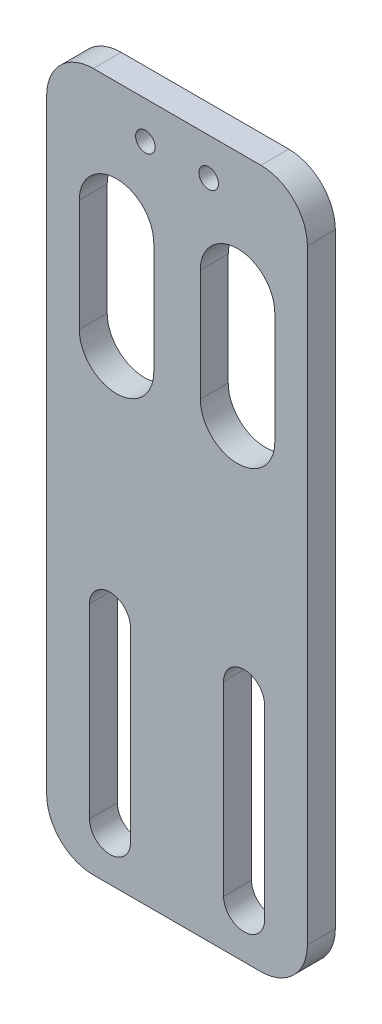
ISO-10303-21;
HEADER;
FILE_DESCRIPTION(('STEP AP214'),'2;1');
FILE_NAME('part.step','',(''),(''),'','','');
FILE_SCHEMA(('AUTOMOTIVE_DESIGN { 1 0 10303 214 1 1 1 1 }'));
ENDSEC;
DATA;
#1=APPLICATION_CONTEXT('core data for automotive mechanical design processes');
#2=APPLICATION_PROTOCOL_DEFINITION('international standard','automotive_design',2000,#1);
#3=PRODUCT_CONTEXT('',#1,'mechanical');
#4=PRODUCT('Part','Part','',(#3));
#5=PRODUCT_RELATED_PRODUCT_CATEGORY('part','',(#4));
#6=PRODUCT_DEFINITION_FORMATION('','',#4);
#7=PRODUCT_DEFINITION_CONTEXT('part definition',#1,'design');
#8=PRODUCT_DEFINITION('design','',#6,#7);
#9=PRODUCT_DEFINITION_SHAPE('','',#8);
#10=(LENGTH_UNIT() NAMED_UNIT(*) SI_UNIT(.MILLI.,.METRE.));
#11=(NAMED_UNIT(*) PLANE_ANGLE_UNIT() SI_UNIT($,.RADIAN.));
#12=(NAMED_UNIT(*) SI_UNIT($,.STERADIAN.) SOLID_ANGLE_UNIT());
#13=UNCERTAINTY_MEASURE_WITH_UNIT(LENGTH_MEASURE(1.E-05),#10,'distance_accuracy_value','');
#14=(GEOMETRIC_REPRESENTATION_CONTEXT(3) GLOBAL_UNCERTAINTY_ASSIGNED_CONTEXT((#13)) GLOBAL_UNIT_ASSIGNED_CONTEXT((#10,
#11,#12)) REPRESENTATION_CONTEXT('',''));
#15=CARTESIAN_POINT('',(0.,0.,0.));
#16=DIRECTION('',(0.,0.,1.));
#17=DIRECTION('',(1.,0.,0.));
#18=AXIS2_PLACEMENT_3D('',#15,#16,#17);
#19=CARTESIAN_POINT('',(-14.,37.5,3.));
#20=DIRECTION('',(1.,0.,0.));
#21=DIRECTION('',(0.,1.,0.));
#22=AXIS2_PLACEMENT_3D('',#19,#20,#21);
#23=PLANE('',#22);
#24=DIRECTION('',(0.,-1.,0.));
#25=VECTOR('',#24,1.);
#26=CARTESIAN_POINT('',(-14.,37.5,3.));
#27=LINE('',#26,#25);
#28=CARTESIAN_POINT('',(-14.,32.5,3.));
#29=VERTEX_POINT('',#28);
#30=CARTESIAN_POINT('',(-14.,-32.5,3.));
#31=VERTEX_POINT('',#30);
#32=EDGE_CURVE('E346',#29,#31,#27,.T.);
#33=ORIENTED_EDGE('',*,*,#32,.F.);
#34=DIRECTION('',(0.,0.,-1.));
#35=VECTOR('',#34,1.);
#36=CARTESIAN_POINT('',(-14.,32.5,3.));
#37=LINE('',#36,#35);
#38=CARTESIAN_POINT('',(-14.,32.5,0.));
#39=VERTEX_POINT('',#38);
#40=EDGE_CURVE('E368',#29,#39,#37,.T.);
#41=ORIENTED_EDGE('',*,*,#40,.T.);
#42=DIRECTION('',(0.,-1.,0.));
#43=VECTOR('',#42,1.);
#44=CARTESIAN_POINT('',(-14.,37.5,0.));
#45=LINE('',#44,#43);
#46=CARTESIAN_POINT('',(-14.,-32.5,0.));
#47=VERTEX_POINT('',#46);
#48=EDGE_CURVE('E339',#39,#47,#45,.T.);
#49=ORIENTED_EDGE('',*,*,#48,.T.);
#50=DIRECTION('',(0.,0.,-1.));
#51=VECTOR('',#50,1.);
#52=CARTESIAN_POINT('',(-14.,-32.5,3.));
#53=LINE('',#52,#51);
#54=EDGE_CURVE('E357',#47,#31,#53,.F.);
#55=ORIENTED_EDGE('',*,*,#54,.T.);
#56=EDGE_LOOP('',(#33,#41,#49,#55));
#57=FACE_BOUND('',#56,.T.);
#58=ADVANCED_FACE('F32',(#57),#23,.F.);
#59=CARTESIAN_POINT('',(14.,-37.5,3.));
#60=DIRECTION('',(0.,1.,0.));
#61=DIRECTION('',(0.,0.,1.));
#62=AXIS2_PLACEMENT_3D('',#59,#60,#61);
#63=PLANE('',#62);
#64=DIRECTION('',(1.,0.,0.));
#65=VECTOR('',#64,1.);
#66=CARTESIAN_POINT('',(14.,-37.5,0.));
#67=LINE('',#66,#65);
#68=CARTESIAN_POINT('',(-8.99999999999999,-37.5,0.));
#69=VERTEX_POINT('',#68);
#70=CARTESIAN_POINT('',(9.00000000000001,-37.5,0.));
#71=VERTEX_POINT('',#70);
#72=EDGE_CURVE('E360',#69,#71,#67,.T.);
#73=ORIENTED_EDGE('',*,*,#72,.T.);
#74=DIRECTION('',(0.,0.,-1.));
#75=VECTOR('',#74,1.);
#76=CARTESIAN_POINT('',(9.00000000000001,-37.5,3.));
#77=LINE('',#76,#75);
#78=CARTESIAN_POINT('',(9.00000000000001,-37.5,3.));
#79=VERTEX_POINT('',#78);
#80=EDGE_CURVE('E11',#71,#79,#77,.F.);
#81=ORIENTED_EDGE('',*,*,#80,.T.);
#82=DIRECTION('',(1.,0.,0.));
#83=VECTOR('',#82,1.);
#84=CARTESIAN_POINT('',(14.,-37.5,3.));
#85=LINE('',#84,#83);
#86=CARTESIAN_POINT('',(-8.99999999999999,-37.5,3.));
#87=VERTEX_POINT('',#86);
#88=EDGE_CURVE('E349',#87,#79,#85,.T.);
#89=ORIENTED_EDGE('',*,*,#88,.F.);
#90=DIRECTION('',(0.,0.,-1.));
#91=VECTOR('',#90,1.);
#92=CARTESIAN_POINT('',(-8.99999999999999,-37.5,3.));
#93=LINE('',#92,#91);
#94=EDGE_CURVE('E40',#87,#69,#93,.T.);
#95=ORIENTED_EDGE('',*,*,#94,.T.);
#96=EDGE_LOOP('',(#73,#81,#89,#95));
#97=FACE_BOUND('',#96,.T.);
#98=ADVANCED_FACE('F399',(#97),#63,.F.);
#99=CARTESIAN_POINT('',(14.,37.5,3.));
#100=DIRECTION('',(-1.,0.,0.));
#101=DIRECTION('',(0.,-1.,0.));
#102=AXIS2_PLACEMENT_3D('',#99,#100,#101);
#103=PLANE('',#102);
#104=DIRECTION('',(0.,1.,0.));
#105=VECTOR('',#104,1.);
#106=CARTESIAN_POINT('',(14.,37.5,0.));
#107=LINE('',#106,#105);
#108=CARTESIAN_POINT('',(14.,-32.5,0.));
#109=VERTEX_POINT('',#108);
#110=CARTESIAN_POINT('',(14.,32.5,0.));
#111=VERTEX_POINT('',#110);
#112=EDGE_CURVE('E363',#109,#111,#107,.T.);
#113=ORIENTED_EDGE('',*,*,#112,.T.);
#114=DIRECTION('',(0.,0.,-1.));
#115=VECTOR('',#114,1.);
#116=CARTESIAN_POINT('',(14.,32.5,3.));
#117=LINE('',#116,#115);
#118=CARTESIAN_POINT('',(14.,32.5,3.));
#119=VERTEX_POINT('',#118);
#120=EDGE_CURVE('E47',#111,#119,#117,.F.);
#121=ORIENTED_EDGE('',*,*,#120,.T.);
#122=DIRECTION('',(0.,1.,0.));
#123=VECTOR('',#122,1.);
#124=CARTESIAN_POINT('',(14.,37.5,3.));
#125=LINE('',#124,#123);
#126=CARTESIAN_POINT('',(14.,-32.5,3.));
#127=VERTEX_POINT('',#126);
#128=EDGE_CURVE('E352',#127,#119,#125,.T.);
#129=ORIENTED_EDGE('',*,*,#128,.F.);
#130=DIRECTION('',(0.,0.,-1.));
#131=VECTOR('',#130,1.);
#132=CARTESIAN_POINT('',(14.,-32.5,3.));
#133=LINE('',#132,#131);
#134=EDGE_CURVE('E391',#127,#109,#133,.T.);
#135=ORIENTED_EDGE('',*,*,#134,.T.);
#136=EDGE_LOOP('',(#113,#121,#129,#135));
#137=FACE_BOUND('',#136,.T.);
#138=ADVANCED_FACE('F409',(#137),#103,.F.);
#139=CARTESIAN_POINT('',(14.,37.5,3.));
#140=DIRECTION('',(0.,-1.,0.));
#141=DIRECTION('',(0.,0.,-1.));
#142=AXIS2_PLACEMENT_3D('',#139,#140,#141);
#143=PLANE('',#142);
#144=DIRECTION('',(-1.,0.,0.));
#145=VECTOR('',#144,1.);
#146=CARTESIAN_POINT('',(14.,37.5,0.));
#147=LINE('',#146,#145);
#148=CARTESIAN_POINT('',(9.,37.5,0.));
#149=VERTEX_POINT('',#148);
#150=CARTESIAN_POINT('',(-9.,37.5,0.));
#151=VERTEX_POINT('',#150);
#152=EDGE_CURVE('E350',#149,#151,#147,.T.);
#153=ORIENTED_EDGE('',*,*,#152,.T.);
#154=DIRECTION('',(0.,0.,-1.));
#155=VECTOR('',#154,1.);
#156=CARTESIAN_POINT('',(-9.,37.5,3.));
#157=LINE('',#156,#155);
#158=CARTESIAN_POINT('',(-9.,37.5,3.));
#159=VERTEX_POINT('',#158);
#160=EDGE_CURVE('E382',#151,#159,#157,.F.);
#161=ORIENTED_EDGE('',*,*,#160,.T.);
#162=DIRECTION('',(-1.,0.,0.));
#163=VECTOR('',#162,1.);
#164=CARTESIAN_POINT('',(14.,37.5,3.));
#165=LINE('',#164,#163);
#166=CARTESIAN_POINT('',(9.,37.5,3.));
#167=VERTEX_POINT('',#166);
#168=EDGE_CURVE('E354',#167,#159,#165,.T.);
#169=ORIENTED_EDGE('',*,*,#168,.F.);
#170=DIRECTION('',(0.,0.,-1.));
#171=VECTOR('',#170,1.);
#172=CARTESIAN_POINT('',(9.,37.5,3.));
#173=LINE('',#172,#171);
#174=EDGE_CURVE('E379',#167,#149,#173,.T.);
#175=ORIENTED_EDGE('',*,*,#174,.T.);
#176=EDGE_LOOP('',(#153,#161,#169,#175));
#177=FACE_BOUND('',#176,.T.);
#178=ADVANCED_FACE('F418',(#177),#143,.F.);
#179=CARTESIAN_POINT('',(0.,0.,3.));
#180=DIRECTION('',(0.,0.,-1.));
#181=DIRECTION('',(-1.,0.,0.));
#182=AXIS2_PLACEMENT_3D('',#179,#180,#181);
#183=PLANE('',#182);
#184=DIRECTION('',(0.,1.,0.));
#185=VECTOR('',#184,1.);
#186=CARTESIAN_POINT('',(9.40000000000001,-32.5,3.));
#187=LINE('',#186,#185);
#188=CARTESIAN_POINT('',(9.40000000000001,-32.5,3.));
#189=VERTEX_POINT('',#188);
#190=CARTESIAN_POINT('',(9.40000000000001,-12.5,3.));
#191=VERTEX_POINT('',#190);
#192=EDGE_CURVE('E228',#189,#191,#187,.T.);
#193=ORIENTED_EDGE('',*,*,#192,.F.);
#194=CARTESIAN_POINT('',(7.20000000000001,-32.5,3.));
#195=DIRECTION('',(0.,0.,1.));
#196=DIRECTION('',(1.,0.,0.));
#197=AXIS2_PLACEMENT_3D('',#194,#195,#196);
#198=CIRCLE('',#197,2.2);
#199=CARTESIAN_POINT('',(5.00000000000001,-32.5,3.));
#200=VERTEX_POINT('',#199);
#201=EDGE_CURVE('E201',#200,#189,#198,.T.);
#202=ORIENTED_EDGE('',*,*,#201,.F.);
#203=DIRECTION('',(0.,-1.,0.));
#204=VECTOR('',#203,1.);
#205=CARTESIAN_POINT('',(5.00000000000001,-32.5,3.));
#206=LINE('',#205,#204);
#207=CARTESIAN_POINT('',(5.00000000000001,-12.5,3.));
#208=VERTEX_POINT('',#207);
#209=EDGE_CURVE('E219',#208,#200,#206,.T.);
#210=ORIENTED_EDGE('',*,*,#209,.F.);
#211=CARTESIAN_POINT('',(7.20000000000001,-12.5,3.));
#212=DIRECTION('',(0.,0.,1.));
#213=DIRECTION('',(1.,0.,0.));
#214=AXIS2_PLACEMENT_3D('',#211,#212,#213);
#215=CIRCLE('',#214,2.2);
#216=EDGE_CURVE('E222',#191,#208,#215,.T.);
#217=ORIENTED_EDGE('',*,*,#216,.F.);
#218=EDGE_LOOP('',(#193,#202,#210,#217));
#219=FACE_BOUND('',#218,.T.);
#220=DIRECTION('',(0.,1.,0.));
#221=VECTOR('',#220,1.);
#222=CARTESIAN_POINT('',(10.4999999571592,12.5,3.));
#223=LINE('',#222,#221);
#224=CARTESIAN_POINT('',(10.4999999571592,12.5,3.));
#225=VERTEX_POINT('',#224);
#226=CARTESIAN_POINT('',(10.4999999571592,24.5,3.));
#227=VERTEX_POINT('',#226);
#228=EDGE_CURVE('E253',#225,#227,#223,.T.);
#229=ORIENTED_EDGE('',*,*,#228,.F.);
#230=CARTESIAN_POINT('',(6.50000000000001,12.5,3.));
#231=DIRECTION('',(0.,0.,1.));
#232=DIRECTION('',(1.,0.,0.));
#233=AXIS2_PLACEMENT_3D('',#230,#231,#232);
#234=CIRCLE('',#233,3.99999995715916);
#235=CARTESIAN_POINT('',(2.50000004284085,12.5,3.));
#236=VERTEX_POINT('',#235);
#237=EDGE_CURVE('E234',#236,#225,#234,.T.);
#238=ORIENTED_EDGE('',*,*,#237,.F.);
#239=DIRECTION('',(0.,-1.,0.));
#240=VECTOR('',#239,1.);
#241=CARTESIAN_POINT('',(2.50000004284085,12.5,3.));
#242=LINE('',#241,#240);
#243=CARTESIAN_POINT('',(2.50000004284085,24.5,3.));
#244=VERTEX_POINT('',#243);
#245=EDGE_CURVE('E242',#244,#236,#242,.T.);
#246=ORIENTED_EDGE('',*,*,#245,.F.);
#247=CARTESIAN_POINT('',(6.50000000000001,24.5,3.));
#248=DIRECTION('',(0.,0.,1.));
#249=DIRECTION('',(1.,0.,0.));
#250=AXIS2_PLACEMENT_3D('',#247,#248,#249);
#251=CIRCLE('',#250,3.99999995715916);
#252=EDGE_CURVE('E256',#227,#244,#251,.T.);
#253=ORIENTED_EDGE('',*,*,#252,.F.);
#254=EDGE_LOOP('',(#229,#238,#246,#253));
#255=FACE_BOUND('',#254,.T.);
#256=CARTESIAN_POINT('',(3.4,33.5,3.));
#257=DIRECTION('',(0.,0.,1.));
#258=DIRECTION('',(1.,0.,0.));
#259=AXIS2_PLACEMENT_3D('',#256,#257,#258);
#260=CIRCLE('',#259,1.05);
#261=CARTESIAN_POINT('',(4.45,33.5,3.));
#262=VERTEX_POINT('',#261);
#263=EDGE_CURVE('E263',#262,#262,#260,.T.);
#264=ORIENTED_EDGE('',*,*,#263,.F.);
#265=EDGE_LOOP('',(#264));
#266=FACE_BOUND('',#265,.T.);
#267=CARTESIAN_POINT('',(-3.4,33.5,3.));
#268=DIRECTION('',(0.,0.,1.));
#269=DIRECTION('',(1.,0.,0.));
#270=AXIS2_PLACEMENT_3D('',#267,#268,#269);
#271=CIRCLE('',#270,1.05);
#272=CARTESIAN_POINT('',(-2.35,33.5,3.));
#273=VERTEX_POINT('',#272);
#274=EDGE_CURVE('E273',#273,#273,#271,.T.);
#275=ORIENTED_EDGE('',*,*,#274,.F.);
#276=EDGE_LOOP('',(#275));
#277=FACE_BOUND('',#276,.T.);
#278=DIRECTION('',(0.,1.,0.));
#279=VECTOR('',#278,1.);
#280=CARTESIAN_POINT('',(-5.,-32.5,3.));
#281=LINE('',#280,#279);
#282=CARTESIAN_POINT('',(-5.,-32.5,3.));
#283=VERTEX_POINT('',#282);
#284=CARTESIAN_POINT('',(-5.00000000000001,-12.5,3.));
#285=VERTEX_POINT('',#284);
#286=EDGE_CURVE('E297',#283,#285,#281,.T.);
#287=ORIENTED_EDGE('',*,*,#286,.F.);
#288=CARTESIAN_POINT('',(-7.2,-32.5,3.));
#289=DIRECTION('',(0.,0.,1.));
#290=DIRECTION('',(1.,0.,0.));
#291=AXIS2_PLACEMENT_3D('',#288,#289,#290);
#292=CIRCLE('',#291,2.2);
#293=CARTESIAN_POINT('',(-9.4,-32.5,3.));
#294=VERTEX_POINT('',#293);
#295=EDGE_CURVE('E279',#294,#283,#292,.T.);
#296=ORIENTED_EDGE('',*,*,#295,.F.);
#297=DIRECTION('',(0.,-1.,0.));
#298=VECTOR('',#297,1.);
#299=CARTESIAN_POINT('',(-9.4,-32.5,3.));
#300=LINE('',#299,#298);
#301=CARTESIAN_POINT('',(-9.40000000000001,-12.5,3.));
#302=VERTEX_POINT('',#301);
#303=EDGE_CURVE('E286',#302,#294,#300,.T.);
#304=ORIENTED_EDGE('',*,*,#303,.F.);
#305=CARTESIAN_POINT('',(-7.20000000000001,-12.5,3.));
#306=DIRECTION('',(0.,0.,1.));
#307=DIRECTION('',(1.,0.,0.));
#308=AXIS2_PLACEMENT_3D('',#305,#306,#307);
#309=CIRCLE('',#308,2.2);
#310=EDGE_CURVE('E300',#285,#302,#309,.T.);
#311=ORIENTED_EDGE('',*,*,#310,.F.);
#312=EDGE_LOOP('',(#287,#296,#304,#311));
#313=FACE_BOUND('',#312,.T.);
#314=DIRECTION('',(0.,1.,0.));
#315=VECTOR('',#314,1.);
#316=CARTESIAN_POINT('',(-2.50000004284084,12.5,3.));
#317=LINE('',#316,#315);
#318=CARTESIAN_POINT('',(-2.50000004284084,12.5,3.));
#319=VERTEX_POINT('',#318);
#320=CARTESIAN_POINT('',(-2.50000004284085,24.5,3.));
#321=VERTEX_POINT('',#320);
#322=EDGE_CURVE('E329',#319,#321,#317,.T.);
#323=ORIENTED_EDGE('',*,*,#322,.F.);
#324=CARTESIAN_POINT('',(-6.5,12.5,3.));
#325=DIRECTION('',(0.,0.,1.));
#326=DIRECTION('',(1.,0.,0.));
#327=AXIS2_PLACEMENT_3D('',#324,#325,#326);
#328=CIRCLE('',#327,3.99999995715916);
#329=CARTESIAN_POINT('',(-10.4999999571592,12.5,3.));
#330=VERTEX_POINT('',#329);
#331=EDGE_CURVE('E307',#330,#319,#328,.T.);
#332=ORIENTED_EDGE('',*,*,#331,.F.);
#333=DIRECTION('',(0.,-1.,0.));
#334=VECTOR('',#333,1.);
#335=CARTESIAN_POINT('',(-10.4999999571592,12.5,3.));
#336=LINE('',#335,#334);
#337=CARTESIAN_POINT('',(-10.4999999571592,24.5,3.));
#338=VERTEX_POINT('',#337);
#339=EDGE_CURVE('E318',#338,#330,#336,.T.);
#340=ORIENTED_EDGE('',*,*,#339,.F.);
#341=CARTESIAN_POINT('',(-6.50000000000001,24.5,3.));
#342=DIRECTION('',(0.,0.,1.));
#343=DIRECTION('',(1.,0.,0.));
#344=AXIS2_PLACEMENT_3D('',#341,#342,#343);
#345=CIRCLE('',#344,3.99999995715916);
#346=EDGE_CURVE('E332',#321,#338,#345,.T.);
#347=ORIENTED_EDGE('',*,*,#346,.F.);
#348=EDGE_LOOP('',(#323,#332,#340,#347));
#349=FACE_BOUND('',#348,.T.);
#350=ORIENTED_EDGE('',*,*,#168,.T.);
#351=CARTESIAN_POINT('',(-9.,32.5,3.));
#352=DIRECTION('',(0.,0.,-1.));
#353=DIRECTION('',(-1.,0.,0.));
#354=AXIS2_PLACEMENT_3D('',#351,#352,#353);
#355=CIRCLE('',#354,5.);
#356=EDGE_CURVE('E389',#159,#29,#355,.F.);
#357=ORIENTED_EDGE('',*,*,#356,.T.);
#358=ORIENTED_EDGE('',*,*,#32,.T.);
#359=CARTESIAN_POINT('',(-8.99999999999999,-32.5,3.));
#360=DIRECTION('',(0.,0.,-1.));
#361=DIRECTION('',(-1.,0.,0.));
#362=AXIS2_PLACEMENT_3D('',#359,#360,#361);
#363=CIRCLE('',#362,5.);
#364=EDGE_CURVE('E384',#31,#87,#363,.F.);
#365=ORIENTED_EDGE('',*,*,#364,.T.);
#366=ORIENTED_EDGE('',*,*,#88,.T.);
#367=CARTESIAN_POINT('',(9.00000000000001,-32.5,3.));
#368=DIRECTION('',(0.,0.,-1.));
#369=DIRECTION('',(-1.,0.,0.));
#370=AXIS2_PLACEMENT_3D('',#367,#368,#369);
#371=CIRCLE('',#370,5.);
#372=EDGE_CURVE('E54',#79,#127,#371,.F.);
#373=ORIENTED_EDGE('',*,*,#372,.T.);
#374=ORIENTED_EDGE('',*,*,#128,.T.);
#375=CARTESIAN_POINT('',(9.,32.5,3.));
#376=DIRECTION('',(0.,0.,-1.));
#377=DIRECTION('',(-1.,0.,0.));
#378=AXIS2_PLACEMENT_3D('',#375,#376,#377);
#379=CIRCLE('',#378,5.);
#380=EDGE_CURVE('E387',#119,#167,#379,.F.);
#381=ORIENTED_EDGE('',*,*,#380,.T.);
#382=EDGE_LOOP('',(#350,#357,#358,#365,#366,#373,#374,#381));
#383=FACE_BOUND('',#382,.T.);
#384=ADVANCED_FACE('F411',(#219,#255,#266,#277,#313,#349,#383),#183,.F.);
#385=CARTESIAN_POINT('',(0.,0.,0.));
#386=DIRECTION('',(0.,0.,-1.));
#387=DIRECTION('',(-1.,0.,0.));
#388=AXIS2_PLACEMENT_3D('',#385,#386,#387);
#389=PLANE('',#388);
#390=CARTESIAN_POINT('',(7.20000000000001,-32.5,0.));
#391=DIRECTION('',(0.,0.,1.));
#392=DIRECTION('',(1.,0.,0.));
#393=AXIS2_PLACEMENT_3D('',#390,#391,#392);
#394=CIRCLE('',#393,2.2);
#395=CARTESIAN_POINT('',(5.00000000000001,-32.5,0.));
#396=VERTEX_POINT('',#395);
#397=CARTESIAN_POINT('',(9.40000000000001,-32.5,0.));
#398=VERTEX_POINT('',#397);
#399=EDGE_CURVE('E198',#396,#398,#394,.T.);
#400=ORIENTED_EDGE('',*,*,#399,.T.);
#401=DIRECTION('',(0.,1.,0.));
#402=VECTOR('',#401,1.);
#403=CARTESIAN_POINT('',(9.40000000000001,-32.5,0.));
#404=LINE('',#403,#402);
#405=CARTESIAN_POINT('',(9.40000000000001,-12.5,0.));
#406=VERTEX_POINT('',#405);
#407=EDGE_CURVE('E210',#398,#406,#404,.T.);
#408=ORIENTED_EDGE('',*,*,#407,.T.);
#409=CARTESIAN_POINT('',(7.20000000000001,-12.5,0.));
#410=DIRECTION('',(0.,0.,1.));
#411=DIRECTION('',(1.,0.,0.));
#412=AXIS2_PLACEMENT_3D('',#409,#410,#411);
#413=CIRCLE('',#412,2.2);
#414=CARTESIAN_POINT('',(5.00000000000001,-12.5,0.));
#415=VERTEX_POINT('',#414);
#416=EDGE_CURVE('E214',#406,#415,#413,.T.);
#417=ORIENTED_EDGE('',*,*,#416,.T.);
#418=DIRECTION('',(0.,-1.,0.));
#419=VECTOR('',#418,1.);
#420=CARTESIAN_POINT('',(5.00000000000001,-32.5,0.));
#421=LINE('',#420,#419);
#422=EDGE_CURVE('E206',#415,#396,#421,.T.);
#423=ORIENTED_EDGE('',*,*,#422,.T.);
#424=EDGE_LOOP('',(#400,#408,#417,#423));
#425=FACE_BOUND('',#424,.T.);
#426=CARTESIAN_POINT('',(6.50000000000001,12.5,0.));
#427=DIRECTION('',(0.,0.,1.));
#428=DIRECTION('',(1.,0.,0.));
#429=AXIS2_PLACEMENT_3D('',#426,#427,#428);
#430=CIRCLE('',#429,3.99999995715916);
#431=CARTESIAN_POINT('',(2.50000004284085,12.5,0.));
#432=VERTEX_POINT('',#431);
#433=CARTESIAN_POINT('',(10.4999999571592,12.5,0.));
#434=VERTEX_POINT('',#433);
#435=EDGE_CURVE('E238',#432,#434,#430,.T.);
#436=ORIENTED_EDGE('',*,*,#435,.T.);
#437=DIRECTION('',(0.,1.,0.));
#438=VECTOR('',#437,1.);
#439=CARTESIAN_POINT('',(10.4999999571592,12.5,0.));
#440=LINE('',#439,#438);
#441=CARTESIAN_POINT('',(10.4999999571592,24.5,0.));
#442=VERTEX_POINT('',#441);
#443=EDGE_CURVE('E241',#434,#442,#440,.T.);
#444=ORIENTED_EDGE('',*,*,#443,.T.);
#445=CARTESIAN_POINT('',(6.50000000000001,24.5,0.));
#446=DIRECTION('',(0.,0.,1.));
#447=DIRECTION('',(1.,0.,0.));
#448=AXIS2_PLACEMENT_3D('',#445,#446,#447);
#449=CIRCLE('',#448,3.99999995715916);
#450=CARTESIAN_POINT('',(2.50000004284085,24.5,0.));
#451=VERTEX_POINT('',#450);
#452=EDGE_CURVE('E245',#442,#451,#449,.T.);
#453=ORIENTED_EDGE('',*,*,#452,.T.);
#454=DIRECTION('',(0.,-1.,0.));
#455=VECTOR('',#454,1.);
#456=CARTESIAN_POINT('',(2.50000004284085,12.5,0.));
#457=LINE('',#456,#455);
#458=EDGE_CURVE('E248',#451,#432,#457,.T.);
#459=ORIENTED_EDGE('',*,*,#458,.T.);
#460=EDGE_LOOP('',(#436,#444,#453,#459));
#461=FACE_BOUND('',#460,.T.);
#462=CARTESIAN_POINT('',(3.4,33.5,0.));
#463=DIRECTION('',(0.,0.,1.));
#464=DIRECTION('',(1.,0.,0.));
#465=AXIS2_PLACEMENT_3D('',#462,#463,#464);
#466=CIRCLE('',#465,1.05);
#467=CARTESIAN_POINT('',(4.45,33.5,0.));
#468=VERTEX_POINT('',#467);
#469=EDGE_CURVE('E270',#468,#468,#466,.T.);
#470=ORIENTED_EDGE('',*,*,#469,.T.);
#471=EDGE_LOOP('',(#470));
#472=FACE_BOUND('',#471,.T.);
#473=CARTESIAN_POINT('',(-3.4,33.5,0.));
#474=DIRECTION('',(0.,0.,1.));
#475=DIRECTION('',(1.,0.,0.));
#476=AXIS2_PLACEMENT_3D('',#473,#474,#475);
#477=CIRCLE('',#476,1.05);
#478=CARTESIAN_POINT('',(-2.35,33.5,0.));
#479=VERTEX_POINT('',#478);
#480=EDGE_CURVE('E276',#479,#479,#477,.T.);
#481=ORIENTED_EDGE('',*,*,#480,.T.);
#482=EDGE_LOOP('',(#481));
#483=FACE_BOUND('',#482,.T.);
#484=CARTESIAN_POINT('',(-7.2,-32.5,0.));
#485=DIRECTION('',(0.,0.,1.));
#486=DIRECTION('',(1.,0.,0.));
#487=AXIS2_PLACEMENT_3D('',#484,#485,#486);
#488=CIRCLE('',#487,2.2);
#489=CARTESIAN_POINT('',(-9.4,-32.5,0.));
#490=VERTEX_POINT('',#489);
#491=CARTESIAN_POINT('',(-5.,-32.5,0.));
#492=VERTEX_POINT('',#491);
#493=EDGE_CURVE('E282',#490,#492,#488,.T.);
#494=ORIENTED_EDGE('',*,*,#493,.T.);
#495=DIRECTION('',(0.,1.,0.));
#496=VECTOR('',#495,1.);
#497=CARTESIAN_POINT('',(-5.,-32.5,0.));
#498=LINE('',#497,#496);
#499=CARTESIAN_POINT('',(-5.00000000000001,-12.5,0.));
#500=VERTEX_POINT('',#499);
#501=EDGE_CURVE('E285',#492,#500,#498,.T.);
#502=ORIENTED_EDGE('',*,*,#501,.T.);
#503=CARTESIAN_POINT('',(-7.20000000000001,-12.5,0.));
#504=DIRECTION('',(0.,0.,1.));
#505=DIRECTION('',(1.,0.,0.));
#506=AXIS2_PLACEMENT_3D('',#503,#504,#505);
#507=CIRCLE('',#506,2.2);
#508=CARTESIAN_POINT('',(-9.40000000000001,-12.5,0.));
#509=VERTEX_POINT('',#508);
#510=EDGE_CURVE('E289',#500,#509,#507,.T.);
#511=ORIENTED_EDGE('',*,*,#510,.T.);
#512=DIRECTION('',(0.,-1.,0.));
#513=VECTOR('',#512,1.);
#514=CARTESIAN_POINT('',(-9.4,-32.5,0.));
#515=LINE('',#514,#513);
#516=EDGE_CURVE('E292',#509,#490,#515,.T.);
#517=ORIENTED_EDGE('',*,*,#516,.T.);
#518=EDGE_LOOP('',(#494,#502,#511,#517));
#519=FACE_BOUND('',#518,.T.);
#520=CARTESIAN_POINT('',(-6.5,12.5,0.));
#521=DIRECTION('',(0.,0.,1.));
#522=DIRECTION('',(1.,0.,0.));
#523=AXIS2_PLACEMENT_3D('',#520,#521,#522);
#524=CIRCLE('',#523,3.99999995715916);
#525=CARTESIAN_POINT('',(-10.4999999571592,12.5,0.));
#526=VERTEX_POINT('',#525);
#527=CARTESIAN_POINT('',(-2.50000004284084,12.5,0.));
#528=VERTEX_POINT('',#527);
#529=EDGE_CURVE('E314',#526,#528,#524,.T.);
#530=ORIENTED_EDGE('',*,*,#529,.T.);
#531=DIRECTION('',(0.,1.,0.));
#532=VECTOR('',#531,1.);
#533=CARTESIAN_POINT('',(-2.50000004284084,12.5,0.));
#534=LINE('',#533,#532);
#535=CARTESIAN_POINT('',(-2.50000004284084,24.5,0.));
#536=VERTEX_POINT('',#535);
#537=EDGE_CURVE('E317',#528,#536,#534,.T.);
#538=ORIENTED_EDGE('',*,*,#537,.T.);
#539=CARTESIAN_POINT('',(-6.50000000000001,24.5,0.));
#540=DIRECTION('',(0.,0.,1.));
#541=DIRECTION('',(1.,0.,0.));
#542=AXIS2_PLACEMENT_3D('',#539,#540,#541);
#543=CIRCLE('',#542,3.99999995715916);
#544=CARTESIAN_POINT('',(-10.4999999571592,24.5,0.));
#545=VERTEX_POINT('',#544);
#546=EDGE_CURVE('E321',#536,#545,#543,.T.);
#547=ORIENTED_EDGE('',*,*,#546,.T.);
#548=DIRECTION('',(0.,-1.,0.));
#549=VECTOR('',#548,1.);
#550=CARTESIAN_POINT('',(-10.4999999571592,12.5,0.));
#551=LINE('',#550,#549);
#552=EDGE_CURVE('E324',#545,#526,#551,.T.);
#553=ORIENTED_EDGE('',*,*,#552,.T.);
#554=EDGE_LOOP('',(#530,#538,#547,#553));
#555=FACE_BOUND('',#554,.T.);
#556=ORIENTED_EDGE('',*,*,#48,.F.);
#557=CARTESIAN_POINT('',(-9.,32.5,0.));
#558=DIRECTION('',(0.,0.,-1.));
#559=DIRECTION('',(-1.,0.,0.));
#560=AXIS2_PLACEMENT_3D('',#557,#558,#559);
#561=CIRCLE('',#560,5.);
#562=EDGE_CURVE('E377',#39,#151,#561,.T.);
#563=ORIENTED_EDGE('',*,*,#562,.T.);
#564=ORIENTED_EDGE('',*,*,#152,.F.);
#565=CARTESIAN_POINT('',(9.,32.5,0.));
#566=DIRECTION('',(0.,0.,-1.));
#567=DIRECTION('',(-1.,0.,0.));
#568=AXIS2_PLACEMENT_3D('',#565,#566,#567);
#569=CIRCLE('',#568,5.);
#570=EDGE_CURVE('E375',#149,#111,#569,.T.);
#571=ORIENTED_EDGE('',*,*,#570,.T.);
#572=ORIENTED_EDGE('',*,*,#112,.F.);
#573=CARTESIAN_POINT('',(9.00000000000001,-32.5,0.));
#574=DIRECTION('',(0.,0.,-1.));
#575=DIRECTION('',(-1.,0.,0.));
#576=AXIS2_PLACEMENT_3D('',#573,#574,#575);
#577=CIRCLE('',#576,5.);
#578=EDGE_CURVE('E373',#109,#71,#577,.T.);
#579=ORIENTED_EDGE('',*,*,#578,.T.);
#580=ORIENTED_EDGE('',*,*,#72,.F.);
#581=CARTESIAN_POINT('',(-8.99999999999999,-32.5,0.));
#582=DIRECTION('',(0.,0.,-1.));
#583=DIRECTION('',(-1.,0.,0.));
#584=AXIS2_PLACEMENT_3D('',#581,#582,#583);
#585=CIRCLE('',#584,5.);
#586=EDGE_CURVE('E371',#69,#47,#585,.T.);
#587=ORIENTED_EDGE('',*,*,#586,.T.);
#588=EDGE_LOOP('',(#556,#563,#564,#571,#572,#579,#580,#587));
#589=FACE_BOUND('',#588,.T.);
#590=ADVANCED_FACE('F216',(#425,#461,#472,#483,#519,#555,#589),#389,.T.);
#591=CARTESIAN_POINT('',(-6.5,12.5,0.));
#592=DIRECTION('',(0.,0.,1.));
#593=DIRECTION('',(1.,0.,0.));
#594=AXIS2_PLACEMENT_3D('',#591,#592,#593);
#595=CYLINDRICAL_SURFACE('',#594,3.99999995715916);
#596=ORIENTED_EDGE('',*,*,#331,.T.);
#597=DIRECTION('',(0.,0.,1.));
#598=VECTOR('',#597,1.);
#599=CARTESIAN_POINT('',(-2.50000004284084,12.5,0.));
#600=LINE('',#599,#598);
#601=EDGE_CURVE('E327',#528,#319,#600,.T.);
#602=ORIENTED_EDGE('',*,*,#601,.F.);
#603=ORIENTED_EDGE('',*,*,#529,.F.);
#604=DIRECTION('',(0.,0.,1.));
#605=VECTOR('',#604,1.);
#606=CARTESIAN_POINT('',(-10.4999999571592,12.5,0.));
#607=LINE('',#606,#605);
#608=EDGE_CURVE('E337',#526,#330,#607,.T.);
#609=ORIENTED_EDGE('',*,*,#608,.T.);
#610=EDGE_LOOP('',(#596,#602,#603,#609));
#611=FACE_BOUND('',#610,.T.);
#612=ADVANCED_FACE('F612',(#611),#595,.F.);
#613=CARTESIAN_POINT('',(-10.4999999571592,12.5,0.));
#614=DIRECTION('',(-1.,0.,0.));
#615=DIRECTION('',(0.,-1.,0.));
#616=AXIS2_PLACEMENT_3D('',#613,#614,#615);
#617=PLANE('',#616);
#618=ORIENTED_EDGE('',*,*,#339,.T.);
#619=ORIENTED_EDGE('',*,*,#608,.F.);
#620=ORIENTED_EDGE('',*,*,#552,.F.);
#621=DIRECTION('',(0.,0.,1.));
#622=VECTOR('',#621,1.);
#623=CARTESIAN_POINT('',(-10.4999999571592,24.5,0.));
#624=LINE('',#623,#622);
#625=EDGE_CURVE('E340',#545,#338,#624,.T.);
#626=ORIENTED_EDGE('',*,*,#625,.T.);
#627=EDGE_LOOP('',(#618,#619,#620,#626));
#628=FACE_BOUND('',#627,.T.);
#629=ADVANCED_FACE('F603',(#628),#617,.F.);
#630=CARTESIAN_POINT('',(-6.50000000000001,24.5,0.));
#631=DIRECTION('',(0.,0.,1.));
#632=DIRECTION('',(1.,0.,0.));
#633=AXIS2_PLACEMENT_3D('',#630,#631,#632);
#634=CYLINDRICAL_SURFACE('',#633,3.99999995715916);
#635=ORIENTED_EDGE('',*,*,#346,.T.);
#636=ORIENTED_EDGE('',*,*,#625,.F.);
#637=ORIENTED_EDGE('',*,*,#546,.F.);
#638=DIRECTION('',(0.,0.,1.));
#639=VECTOR('',#638,1.);
#640=CARTESIAN_POINT('',(-2.50000004284085,24.5,0.));
#641=LINE('',#640,#639);
#642=EDGE_CURVE('E342',#536,#321,#641,.T.);
#643=ORIENTED_EDGE('',*,*,#642,.T.);
#644=EDGE_LOOP('',(#635,#636,#637,#643));
#645=FACE_BOUND('',#644,.T.);
#646=ADVANCED_FACE('F594',(#645),#634,.F.);
#647=CARTESIAN_POINT('',(-2.50000004284084,12.5,0.));
#648=DIRECTION('',(1.,0.,0.));
#649=DIRECTION('',(0.,1.,0.));
#650=AXIS2_PLACEMENT_3D('',#647,#648,#649);
#651=PLANE('',#650);
#652=ORIENTED_EDGE('',*,*,#322,.T.);
#653=ORIENTED_EDGE('',*,*,#642,.F.);
#654=ORIENTED_EDGE('',*,*,#537,.F.);
#655=ORIENTED_EDGE('',*,*,#601,.T.);
#656=EDGE_LOOP('',(#652,#653,#654,#655));
#657=FACE_BOUND('',#656,.T.);
#658=ADVANCED_FACE('F585',(#657),#651,.F.);
#659=CARTESIAN_POINT('',(-7.2,-32.5,0.));
#660=DIRECTION('',(0.,0.,1.));
#661=DIRECTION('',(1.,0.,0.));
#662=AXIS2_PLACEMENT_3D('',#659,#660,#661);
#663=CYLINDRICAL_SURFACE('',#662,2.2);
#664=ORIENTED_EDGE('',*,*,#295,.T.);
#665=DIRECTION('',(0.,0.,1.));
#666=VECTOR('',#665,1.);
#667=CARTESIAN_POINT('',(-5.,-32.5,0.));
#668=LINE('',#667,#666);
#669=EDGE_CURVE('E295',#492,#283,#668,.T.);
#670=ORIENTED_EDGE('',*,*,#669,.F.);
#671=ORIENTED_EDGE('',*,*,#493,.F.);
#672=DIRECTION('',(0.,0.,1.));
#673=VECTOR('',#672,1.);
#674=CARTESIAN_POINT('',(-9.4,-32.5,0.));
#675=LINE('',#674,#673);
#676=EDGE_CURVE('E305',#490,#294,#675,.T.);
#677=ORIENTED_EDGE('',*,*,#676,.T.);
#678=EDGE_LOOP('',(#664,#670,#671,#677));
#679=FACE_BOUND('',#678,.T.);
#680=ADVANCED_FACE('F576',(#679),#663,.F.);
#681=CARTESIAN_POINT('',(-9.4,-32.5,0.));
#682=DIRECTION('',(-1.,0.,0.));
#683=DIRECTION('',(0.,-1.,0.));
#684=AXIS2_PLACEMENT_3D('',#681,#682,#683);
#685=PLANE('',#684);
#686=ORIENTED_EDGE('',*,*,#303,.T.);
#687=ORIENTED_EDGE('',*,*,#676,.F.);
#688=ORIENTED_EDGE('',*,*,#516,.F.);
#689=DIRECTION('',(0.,0.,1.));
#690=VECTOR('',#689,1.);
#691=CARTESIAN_POINT('',(-9.40000000000001,-12.5,0.));
#692=LINE('',#691,#690);
#693=EDGE_CURVE('E308',#509,#302,#692,.T.);
#694=ORIENTED_EDGE('',*,*,#693,.T.);
#695=EDGE_LOOP('',(#686,#687,#688,#694));
#696=FACE_BOUND('',#695,.T.);
#697=ADVANCED_FACE('F567',(#696),#685,.F.);
#698=CARTESIAN_POINT('',(-7.20000000000001,-12.5,0.));
#699=DIRECTION('',(0.,0.,1.));
#700=DIRECTION('',(1.,0.,0.));
#701=AXIS2_PLACEMENT_3D('',#698,#699,#700);
#702=CYLINDRICAL_SURFACE('',#701,2.2);
#703=ORIENTED_EDGE('',*,*,#310,.T.);
#704=ORIENTED_EDGE('',*,*,#693,.F.);
#705=ORIENTED_EDGE('',*,*,#510,.F.);
#706=DIRECTION('',(0.,0.,1.));
#707=VECTOR('',#706,1.);
#708=CARTESIAN_POINT('',(-5.00000000000001,-12.5,0.));
#709=LINE('',#708,#707);
#710=EDGE_CURVE('E310',#500,#285,#709,.T.);
#711=ORIENTED_EDGE('',*,*,#710,.T.);
#712=EDGE_LOOP('',(#703,#704,#705,#711));
#713=FACE_BOUND('',#712,.T.);
#714=ADVANCED_FACE('F558',(#713),#702,.F.);
#715=CARTESIAN_POINT('',(-5.,-32.5,0.));
#716=DIRECTION('',(1.,0.,0.));
#717=DIRECTION('',(0.,1.,0.));
#718=AXIS2_PLACEMENT_3D('',#715,#716,#717);
#719=PLANE('',#718);
#720=ORIENTED_EDGE('',*,*,#286,.T.);
#721=ORIENTED_EDGE('',*,*,#710,.F.);
#722=ORIENTED_EDGE('',*,*,#501,.F.);
#723=ORIENTED_EDGE('',*,*,#669,.T.);
#724=EDGE_LOOP('',(#720,#721,#722,#723));
#725=FACE_BOUND('',#724,.T.);
#726=ADVANCED_FACE('F549',(#725),#719,.F.);
#727=CARTESIAN_POINT('',(-3.4,33.5,0.));
#728=DIRECTION('',(0.,0.,1.));
#729=DIRECTION('',(1.,0.,0.));
#730=AXIS2_PLACEMENT_3D('',#727,#728,#729);
#731=CYLINDRICAL_SURFACE('',#730,1.05);
#732=ORIENTED_EDGE('',*,*,#480,.F.);
#733=EDGE_LOOP('',(#732));
#734=FACE_BOUND('',#733,.T.);
#735=ORIENTED_EDGE('',*,*,#274,.T.);
#736=EDGE_LOOP('',(#735));
#737=FACE_BOUND('',#736,.T.);
#738=ADVANCED_FACE('F540',(#734,#737),#731,.F.);
#739=CARTESIAN_POINT('',(3.4,33.5,0.));
#740=DIRECTION('',(0.,0.,1.));
#741=DIRECTION('',(1.,0.,0.));
#742=AXIS2_PLACEMENT_3D('',#739,#740,#741);
#743=CYLINDRICAL_SURFACE('',#742,1.05);
#744=ORIENTED_EDGE('',*,*,#469,.F.);
#745=EDGE_LOOP('',(#744));
#746=FACE_BOUND('',#745,.T.);
#747=ORIENTED_EDGE('',*,*,#263,.T.);
#748=EDGE_LOOP('',(#747));
#749=FACE_BOUND('',#748,.T.);
#750=ADVANCED_FACE('F531',(#746,#749),#743,.F.);
#751=CARTESIAN_POINT('',(6.50000000000001,12.5,0.));
#752=DIRECTION('',(0.,0.,1.));
#753=DIRECTION('',(1.,0.,0.));
#754=AXIS2_PLACEMENT_3D('',#751,#752,#753);
#755=CYLINDRICAL_SURFACE('',#754,3.99999995715916);
#756=ORIENTED_EDGE('',*,*,#237,.T.);
#757=DIRECTION('',(0.,0.,1.));
#758=VECTOR('',#757,1.);
#759=CARTESIAN_POINT('',(10.4999999571592,12.5,0.));
#760=LINE('',#759,#758);
#761=EDGE_CURVE('E251',#434,#225,#760,.T.);
#762=ORIENTED_EDGE('',*,*,#761,.F.);
#763=ORIENTED_EDGE('',*,*,#435,.F.);
#764=DIRECTION('',(0.,0.,1.));
#765=VECTOR('',#764,1.);
#766=CARTESIAN_POINT('',(2.50000004284085,12.5,0.));
#767=LINE('',#766,#765);
#768=EDGE_CURVE('E261',#432,#236,#767,.T.);
#769=ORIENTED_EDGE('',*,*,#768,.T.);
#770=EDGE_LOOP('',(#756,#762,#763,#769));
#771=FACE_BOUND('',#770,.T.);
#772=ADVANCED_FACE('F522',(#771),#755,.F.);
#773=CARTESIAN_POINT('',(2.50000004284085,12.5,0.));
#774=DIRECTION('',(-1.,0.,0.));
#775=DIRECTION('',(0.,0.,1.));
#776=AXIS2_PLACEMENT_3D('',#773,#774,#775);
#777=PLANE('',#776);
#778=ORIENTED_EDGE('',*,*,#245,.T.);
#779=ORIENTED_EDGE('',*,*,#768,.F.);
#780=ORIENTED_EDGE('',*,*,#458,.F.);
#781=DIRECTION('',(0.,0.,1.));
#782=VECTOR('',#781,1.);
#783=CARTESIAN_POINT('',(2.50000004284085,24.5,0.));
#784=LINE('',#783,#782);
#785=EDGE_CURVE('E264',#451,#244,#784,.T.);
#786=ORIENTED_EDGE('',*,*,#785,.T.);
#787=EDGE_LOOP('',(#778,#779,#780,#786));
#788=FACE_BOUND('',#787,.T.);
#789=ADVANCED_FACE('F513',(#788),#777,.F.);
#790=CARTESIAN_POINT('',(6.50000000000001,24.5,0.));
#791=DIRECTION('',(0.,0.,1.));
#792=DIRECTION('',(1.,0.,0.));
#793=AXIS2_PLACEMENT_3D('',#790,#791,#792);
#794=CYLINDRICAL_SURFACE('',#793,3.99999995715916);
#795=ORIENTED_EDGE('',*,*,#252,.T.);
#796=ORIENTED_EDGE('',*,*,#785,.F.);
#797=ORIENTED_EDGE('',*,*,#452,.F.);
#798=DIRECTION('',(0.,0.,1.));
#799=VECTOR('',#798,1.);
#800=CARTESIAN_POINT('',(10.4999999571592,24.5,0.));
#801=LINE('',#800,#799);
#802=EDGE_CURVE('E266',#442,#227,#801,.T.);
#803=ORIENTED_EDGE('',*,*,#802,.T.);
#804=EDGE_LOOP('',(#795,#796,#797,#803));
#805=FACE_BOUND('',#804,.T.);
#806=ADVANCED_FACE('F504',(#805),#794,.F.);
#807=CARTESIAN_POINT('',(10.4999999571592,12.5,0.));
#808=DIRECTION('',(1.,0.,0.));
#809=DIRECTION('',(0.,0.,-1.));
#810=AXIS2_PLACEMENT_3D('',#807,#808,#809);
#811=PLANE('',#810);
#812=ORIENTED_EDGE('',*,*,#228,.T.);
#813=ORIENTED_EDGE('',*,*,#802,.F.);
#814=ORIENTED_EDGE('',*,*,#443,.F.);
#815=ORIENTED_EDGE('',*,*,#761,.T.);
#816=EDGE_LOOP('',(#812,#813,#814,#815));
#817=FACE_BOUND('',#816,.T.);
#818=ADVANCED_FACE('F496',(#817),#811,.F.);
#819=CARTESIAN_POINT('',(7.20000000000001,-32.5,0.));
#820=DIRECTION('',(0.,0.,1.));
#821=DIRECTION('',(1.,0.,0.));
#822=AXIS2_PLACEMENT_3D('',#819,#820,#821);
#823=CYLINDRICAL_SURFACE('',#822,2.2);
#824=ORIENTED_EDGE('',*,*,#201,.T.);
#825=DIRECTION('',(0.,0.,1.));
#826=VECTOR('',#825,1.);
#827=CARTESIAN_POINT('',(9.40000000000001,-32.5,0.));
#828=LINE('',#827,#826);
#829=EDGE_CURVE('E194',#398,#189,#828,.T.);
#830=ORIENTED_EDGE('',*,*,#829,.F.);
#831=ORIENTED_EDGE('',*,*,#399,.F.);
#832=DIRECTION('',(0.,0.,1.));
#833=VECTOR('',#832,1.);
#834=CARTESIAN_POINT('',(5.00000000000001,-32.5,0.));
#835=LINE('',#834,#833);
#836=EDGE_CURVE('E232',#396,#200,#835,.T.);
#837=ORIENTED_EDGE('',*,*,#836,.T.);
#838=EDGE_LOOP('',(#824,#830,#831,#837));
#839=FACE_BOUND('',#838,.T.);
#840=ADVANCED_FACE('F196',(#839),#823,.F.);
#841=CARTESIAN_POINT('',(5.00000000000001,-32.5,0.));
#842=DIRECTION('',(-1.,0.,0.));
#843=DIRECTION('',(0.,0.,1.));
#844=AXIS2_PLACEMENT_3D('',#841,#842,#843);
#845=PLANE('',#844);
#846=ORIENTED_EDGE('',*,*,#209,.T.);
#847=ORIENTED_EDGE('',*,*,#836,.F.);
#848=ORIENTED_EDGE('',*,*,#422,.F.);
#849=DIRECTION('',(0.,0.,1.));
#850=VECTOR('',#849,1.);
#851=CARTESIAN_POINT('',(5.00000000000001,-12.5,0.));
#852=LINE('',#851,#850);
#853=EDGE_CURVE('E235',#415,#208,#852,.T.);
#854=ORIENTED_EDGE('',*,*,#853,.T.);
#855=EDGE_LOOP('',(#846,#847,#848,#854));
#856=FACE_BOUND('',#855,.T.);
#857=ADVANCED_FACE('F479',(#856),#845,.F.);
#858=CARTESIAN_POINT('',(7.20000000000001,-12.5,0.));
#859=DIRECTION('',(0.,0.,1.));
#860=DIRECTION('',(1.,0.,0.));
#861=AXIS2_PLACEMENT_3D('',#858,#859,#860);
#862=CYLINDRICAL_SURFACE('',#861,2.2);
#863=ORIENTED_EDGE('',*,*,#216,.T.);
#864=ORIENTED_EDGE('',*,*,#853,.F.);
#865=ORIENTED_EDGE('',*,*,#416,.F.);
#866=DIRECTION('',(0.,0.,1.));
#867=VECTOR('',#866,1.);
#868=CARTESIAN_POINT('',(9.40000000000001,-12.5,0.));
#869=LINE('',#868,#867);
#870=EDGE_CURVE('E205',#406,#191,#869,.T.);
#871=ORIENTED_EDGE('',*,*,#870,.T.);
#872=EDGE_LOOP('',(#863,#864,#865,#871));
#873=FACE_BOUND('',#872,.T.);
#874=ADVANCED_FACE('F471',(#873),#862,.F.);
#875=CARTESIAN_POINT('',(9.40000000000001,-32.5,0.));
#876=DIRECTION('',(1.,0.,0.));
#877=DIRECTION('',(0.,0.,-1.));
#878=AXIS2_PLACEMENT_3D('',#875,#876,#877);
#879=PLANE('',#878);
#880=ORIENTED_EDGE('',*,*,#192,.T.);
#881=ORIENTED_EDGE('',*,*,#870,.F.);
#882=ORIENTED_EDGE('',*,*,#407,.F.);
#883=ORIENTED_EDGE('',*,*,#829,.T.);
#884=EDGE_LOOP('',(#880,#881,#882,#883));
#885=FACE_BOUND('',#884,.T.);
#886=ADVANCED_FACE('F211',(#885),#879,.F.);
#887=CARTESIAN_POINT('',(-9.,32.5,3.));
#888=DIRECTION('',(0.,0.,-1.));
#889=DIRECTION('',(-1.,0.,0.));
#890=AXIS2_PLACEMENT_3D('',#887,#888,#889);
#891=CYLINDRICAL_SURFACE('',#890,5.);
#892=ORIENTED_EDGE('',*,*,#356,.F.);
#893=ORIENTED_EDGE('',*,*,#160,.F.);
#894=ORIENTED_EDGE('',*,*,#562,.F.);
#895=ORIENTED_EDGE('',*,*,#40,.F.);
#896=EDGE_LOOP('',(#892,#893,#894,#895));
#897=FACE_BOUND('',#896,.T.);
#898=ADVANCED_FACE('F423',(#897),#891,.T.);
#899=CARTESIAN_POINT('',(9.,32.5,3.));
#900=DIRECTION('',(0.,0.,-1.));
#901=DIRECTION('',(-1.,0.,0.));
#902=AXIS2_PLACEMENT_3D('',#899,#900,#901);
#903=CYLINDRICAL_SURFACE('',#902,5.);
#904=ORIENTED_EDGE('',*,*,#380,.F.);
#905=ORIENTED_EDGE('',*,*,#120,.F.);
#906=ORIENTED_EDGE('',*,*,#570,.F.);
#907=ORIENTED_EDGE('',*,*,#174,.F.);
#908=EDGE_LOOP('',(#904,#905,#906,#907));
#909=FACE_BOUND('',#908,.T.);
#910=ADVANCED_FACE('F415',(#909),#903,.T.);
#911=CARTESIAN_POINT('',(9.00000000000001,-32.5,3.));
#912=DIRECTION('',(0.,0.,-1.));
#913=DIRECTION('',(-1.,0.,0.));
#914=AXIS2_PLACEMENT_3D('',#911,#912,#913);
#915=CYLINDRICAL_SURFACE('',#914,5.);
#916=ORIENTED_EDGE('',*,*,#372,.F.);
#917=ORIENTED_EDGE('',*,*,#80,.F.);
#918=ORIENTED_EDGE('',*,*,#578,.F.);
#919=ORIENTED_EDGE('',*,*,#134,.F.);
#920=EDGE_LOOP('',(#916,#917,#918,#919));
#921=FACE_BOUND('',#920,.T.);
#922=ADVANCED_FACE('F408',(#921),#915,.T.);
#923=CARTESIAN_POINT('',(-8.99999999999999,-32.5,3.));
#924=DIRECTION('',(0.,0.,-1.));
#925=DIRECTION('',(-1.,0.,0.));
#926=AXIS2_PLACEMENT_3D('',#923,#924,#925);
#927=CYLINDRICAL_SURFACE('',#926,5.);
#928=ORIENTED_EDGE('',*,*,#364,.F.);
#929=ORIENTED_EDGE('',*,*,#54,.F.);
#930=ORIENTED_EDGE('',*,*,#586,.F.);
#931=ORIENTED_EDGE('',*,*,#94,.F.);
#932=EDGE_LOOP('',(#928,#929,#930,#931));
#933=FACE_BOUND('',#932,.T.);
#934=ADVANCED_FACE('F34',(#933),#927,.T.);
#935=CLOSED_SHELL('',(#58,#98,#138,#178,#384,#590,#612,#629,#646,#658,#680,#697,#714,#726,#738,
#750,#772,#789,#806,#818,#840,#857,#874,#886,#898,#910,#922,#934));
#936=MANIFOLD_SOLID_BREP('B2',#935);
#937=ADVANCED_BREP_SHAPE_REPRESENTATION('',(#18,#936),#14);
#938=SHAPE_DEFINITION_REPRESENTATION(#9,#937);
ENDSEC;
END-ISO-10303-21;
